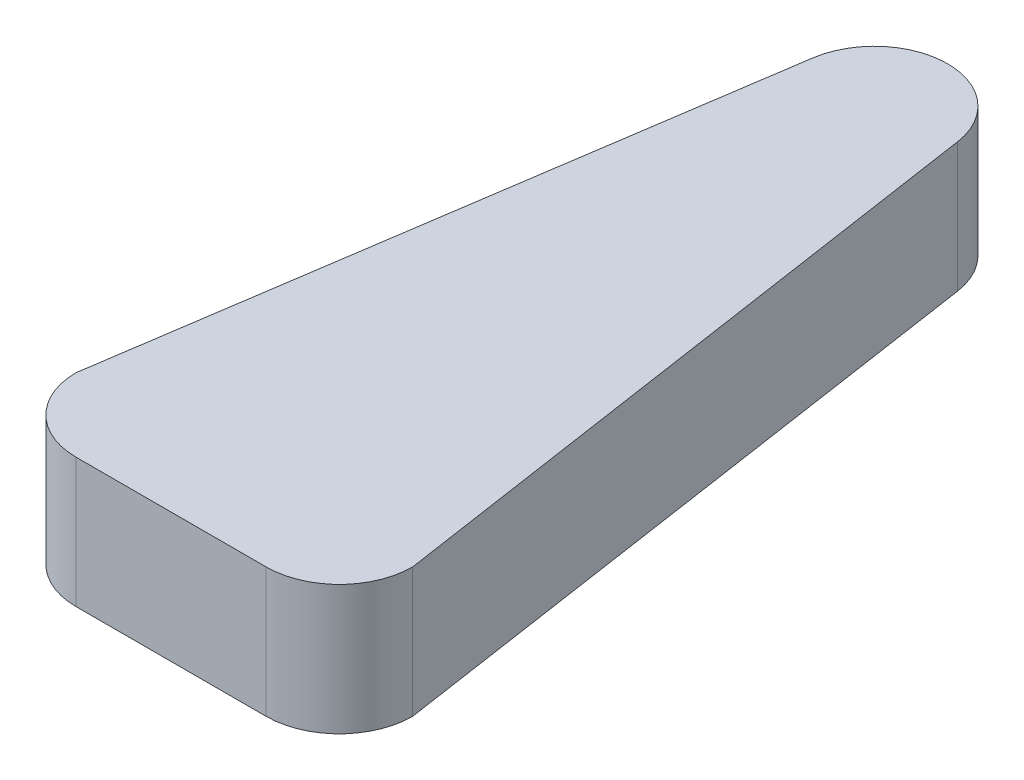
ISO-10303-21;
HEADER;
FILE_DESCRIPTION(('STEP AP214'),'2;1');
FILE_NAME('part.step','',(''),(''),'','','');
FILE_SCHEMA(('AUTOMOTIVE_DESIGN { 1 0 10303 214 1 1 1 1 }'));
ENDSEC;
DATA;
#1=APPLICATION_CONTEXT('core data for automotive mechanical design processes');
#2=APPLICATION_PROTOCOL_DEFINITION('international standard','automotive_design',2000,#1);
#3=PRODUCT_CONTEXT('',#1,'mechanical');
#4=PRODUCT('Part','Part','',(#3));
#5=PRODUCT_RELATED_PRODUCT_CATEGORY('part','',(#4));
#6=PRODUCT_DEFINITION_FORMATION('','',#4);
#7=PRODUCT_DEFINITION_CONTEXT('part definition',#1,'design');
#8=PRODUCT_DEFINITION('design','',#6,#7);
#9=PRODUCT_DEFINITION_SHAPE('','',#8);
#10=(LENGTH_UNIT() NAMED_UNIT(*) SI_UNIT(.MILLI.,.METRE.));
#11=(NAMED_UNIT(*) PLANE_ANGLE_UNIT() SI_UNIT($,.RADIAN.));
#12=(NAMED_UNIT(*) SI_UNIT($,.STERADIAN.) SOLID_ANGLE_UNIT());
#13=UNCERTAINTY_MEASURE_WITH_UNIT(LENGTH_MEASURE(1.E-05),#10,'distance_accuracy_value','');
#14=(GEOMETRIC_REPRESENTATION_CONTEXT(3) GLOBAL_UNCERTAINTY_ASSIGNED_CONTEXT((#13)) GLOBAL_UNIT_ASSIGNED_CONTEXT((#10,
#11,#12)) REPRESENTATION_CONTEXT('',''));
#15=CARTESIAN_POINT('',(0.,0.,0.));
#16=DIRECTION('',(0.,0.,1.));
#17=DIRECTION('',(1.,0.,0.));
#18=AXIS2_PLACEMENT_3D('',#15,#16,#17);
#19=CARTESIAN_POINT('',(0.,6.35,-34.5045034434509));
#20=DIRECTION('',(0.,-1.,0.));
#21=DIRECTION('',(0.,0.,-1.));
#22=AXIS2_PLACEMENT_3D('',#19,#20,#21);
#23=CYLINDRICAL_SURFACE('',#22,3.59549655654913);
#24=CARTESIAN_POINT('',(0.,0.,-34.5045034434509));
#25=DIRECTION('',(0.,1.,0.));
#26=DIRECTION('',(0.,0.,-1.));
#27=AXIS2_PLACEMENT_3D('',#24,#25,#26);
#28=CIRCLE('',#27,3.59549655654913);
#29=CARTESIAN_POINT('',(3.556,0.,-35.0359726223848));
#30=VERTEX_POINT('',#29);
#31=CARTESIAN_POINT('',(-3.556,0.,-35.0359726223848));
#32=VERTEX_POINT('',#31);
#33=EDGE_CURVE('E130',#30,#32,#28,.T.);
#34=ORIENTED_EDGE('',*,*,#33,.T.);
#35=DIRECTION('',(0.,-1.,0.));
#36=VECTOR('',#35,1.);
#37=CARTESIAN_POINT('',(-3.556,6.35,-35.0359726223848));
#38=LINE('',#37,#36);
#39=CARTESIAN_POINT('',(-3.556,6.35,-35.0359726223848));
#40=VERTEX_POINT('',#39);
#41=EDGE_CURVE('E11',#40,#32,#38,.T.);
#42=ORIENTED_EDGE('',*,*,#41,.F.);
#43=CARTESIAN_POINT('',(0.,6.35,-34.5045034434509));
#44=DIRECTION('',(0.,1.,0.));
#45=DIRECTION('',(0.,0.,-1.));
#46=AXIS2_PLACEMENT_3D('',#43,#44,#45);
#47=CIRCLE('',#46,3.59549655654913);
#48=CARTESIAN_POINT('',(3.556,6.35,-35.0359726223848));
#49=VERTEX_POINT('',#48);
#50=EDGE_CURVE('E142',#49,#40,#47,.T.);
#51=ORIENTED_EDGE('',*,*,#50,.F.);
#52=DIRECTION('',(0.,-1.,0.));
#53=VECTOR('',#52,1.);
#54=CARTESIAN_POINT('',(3.556,6.35,-35.0359726223848));
#55=LINE('',#54,#53);
#56=EDGE_CURVE('E126',#49,#30,#55,.T.);
#57=ORIENTED_EDGE('',*,*,#56,.T.);
#58=EDGE_LOOP('',(#34,#42,#51,#57));
#59=FACE_BOUND('',#58,.T.);
#60=ADVANCED_FACE('F34',(#59),#23,.T.);
#61=CARTESIAN_POINT('',(-3.556,6.35,-35.0359726223848));
#62=DIRECTION('',(0.98901499252525,0.,0.147815237916393));
#63=DIRECTION('',(0.147815237916393,0.,-0.98901499252525));
#64=AXIS2_PLACEMENT_3D('',#61,#62,#63);
#65=PLANE('',#64);
#66=DIRECTION('',(-0.147815237916393,0.,0.98901499252525));
#67=VECTOR('',#66,1.);
#68=CARTESIAN_POINT('',(-3.556,0.,-35.0359726223848));
#69=LINE('',#68,#67);
#70=CARTESIAN_POINT('',(-8.255,0.,-3.59549655654913));
#71=VERTEX_POINT('',#70);
#72=EDGE_CURVE('E133',#32,#71,#69,.T.);
#73=ORIENTED_EDGE('',*,*,#72,.T.);
#74=DIRECTION('',(0.,-1.,0.));
#75=VECTOR('',#74,1.);
#76=CARTESIAN_POINT('',(-8.255,6.35,-3.59549655654913));
#77=LINE('',#76,#75);
#78=CARTESIAN_POINT('',(-8.255,6.35,-3.59549655654913));
#79=VERTEX_POINT('',#78);
#80=EDGE_CURVE('E41',#79,#71,#77,.T.);
#81=ORIENTED_EDGE('',*,*,#80,.F.);
#82=DIRECTION('',(-0.147815237916393,0.,0.98901499252525));
#83=VECTOR('',#82,1.);
#84=CARTESIAN_POINT('',(-3.556,6.35,-35.0359726223848));
#85=LINE('',#84,#83);
#86=EDGE_CURVE('E92',#40,#79,#85,.T.);
#87=ORIENTED_EDGE('',*,*,#86,.F.);
#88=ORIENTED_EDGE('',*,*,#41,.T.);
#89=EDGE_LOOP('',(#73,#81,#87,#88));
#90=FACE_BOUND('',#89,.T.);
#91=ADVANCED_FACE('F264',(#90),#65,.F.);
#92=CARTESIAN_POINT('',(-4.65950344345087,6.35,-3.59549655654913));
#93=DIRECTION('',(0.,-1.,0.));
#94=DIRECTION('',(0.,0.,-1.));
#95=AXIS2_PLACEMENT_3D('',#92,#93,#94);
#96=CYLINDRICAL_SURFACE('',#95,3.59549655654913);
#97=CARTESIAN_POINT('',(-4.65950344345087,0.,-3.59549655654913));
#98=DIRECTION('',(0.,1.,0.));
#99=DIRECTION('',(0.,0.,-1.));
#100=AXIS2_PLACEMENT_3D('',#97,#98,#99);
#101=CIRCLE('',#100,3.59549655654913);
#102=CARTESIAN_POINT('',(-4.65950344345087,0.,0.));
#103=VERTEX_POINT('',#102);
#104=EDGE_CURVE('E136',#71,#103,#101,.T.);
#105=ORIENTED_EDGE('',*,*,#104,.T.);
#106=DIRECTION('',(0.,-1.,0.));
#107=VECTOR('',#106,1.);
#108=CARTESIAN_POINT('',(-4.65950344345087,6.35,0.));
#109=LINE('',#108,#107);
#110=CARTESIAN_POINT('',(-4.65950344345087,6.35,0.));
#111=VERTEX_POINT('',#110);
#112=EDGE_CURVE('E121',#111,#103,#109,.T.);
#113=ORIENTED_EDGE('',*,*,#112,.F.);
#114=CARTESIAN_POINT('',(-4.65950344345087,6.35,-3.59549655654913));
#115=DIRECTION('',(0.,1.,0.));
#116=DIRECTION('',(0.,0.,-1.));
#117=AXIS2_PLACEMENT_3D('',#114,#115,#116);
#118=CIRCLE('',#117,3.59549655654913);
#119=EDGE_CURVE('E109',#79,#111,#118,.T.);
#120=ORIENTED_EDGE('',*,*,#119,.F.);
#121=ORIENTED_EDGE('',*,*,#80,.T.);
#122=EDGE_LOOP('',(#105,#113,#120,#121));
#123=FACE_BOUND('',#122,.T.);
#124=ADVANCED_FACE('F148',(#123),#96,.T.);
#125=CARTESIAN_POINT('',(4.65950344345087,6.35,0.));
#126=DIRECTION('',(0.,0.,-1.));
#127=DIRECTION('',(-1.,0.,0.));
#128=AXIS2_PLACEMENT_3D('',#125,#126,#127);
#129=PLANE('',#128);
#130=DIRECTION('',(1.,0.,0.));
#131=VECTOR('',#130,1.);
#132=CARTESIAN_POINT('',(4.65950344345087,0.,0.));
#133=LINE('',#132,#131);
#134=CARTESIAN_POINT('',(4.65950344345087,0.,0.));
#135=VERTEX_POINT('',#134);
#136=EDGE_CURVE('E118',#103,#135,#133,.T.);
#137=ORIENTED_EDGE('',*,*,#136,.T.);
#138=DIRECTION('',(0.,-1.,0.));
#139=VECTOR('',#138,1.);
#140=CARTESIAN_POINT('',(4.65950344345087,6.35,0.));
#141=LINE('',#140,#139);
#142=CARTESIAN_POINT('',(4.65950344345087,6.35,0.));
#143=VERTEX_POINT('',#142);
#144=EDGE_CURVE('E115',#143,#135,#141,.T.);
#145=ORIENTED_EDGE('',*,*,#144,.F.);
#146=DIRECTION('',(1.,0.,0.));
#147=VECTOR('',#146,1.);
#148=CARTESIAN_POINT('',(4.65950344345087,6.35,0.));
#149=LINE('',#148,#147);
#150=EDGE_CURVE('E102',#111,#143,#149,.T.);
#151=ORIENTED_EDGE('',*,*,#150,.F.);
#152=ORIENTED_EDGE('',*,*,#112,.T.);
#153=EDGE_LOOP('',(#137,#145,#151,#152));
#154=FACE_BOUND('',#153,.T.);
#155=ADVANCED_FACE('F116',(#154),#129,.F.);
#156=CARTESIAN_POINT('',(4.65950344345087,6.35,-3.59549655654913));
#157=DIRECTION('',(0.,-1.,0.));
#158=DIRECTION('',(0.,0.,-1.));
#159=AXIS2_PLACEMENT_3D('',#156,#157,#158);
#160=CYLINDRICAL_SURFACE('',#159,3.59549655654913);
#161=CARTESIAN_POINT('',(4.65950344345087,0.,-3.59549655654913));
#162=DIRECTION('',(0.,1.,0.));
#163=DIRECTION('',(0.,0.,-1.));
#164=AXIS2_PLACEMENT_3D('',#161,#162,#163);
#165=CIRCLE('',#164,3.59549655654913);
#166=CARTESIAN_POINT('',(8.255,0.,-3.59549655654913));
#167=VERTEX_POINT('',#166);
#168=EDGE_CURVE('E139',#135,#167,#165,.T.);
#169=ORIENTED_EDGE('',*,*,#168,.T.);
#170=DIRECTION('',(0.,-1.,0.));
#171=VECTOR('',#170,1.);
#172=CARTESIAN_POINT('',(8.255,6.35,-3.59549655654913));
#173=LINE('',#172,#171);
#174=CARTESIAN_POINT('',(8.255,6.35,-3.59549655654913));
#175=VERTEX_POINT('',#174);
#176=EDGE_CURVE('E122',#175,#167,#173,.T.);
#177=ORIENTED_EDGE('',*,*,#176,.F.);
#178=CARTESIAN_POINT('',(4.65950344345087,6.35,-3.59549655654913));
#179=DIRECTION('',(0.,1.,0.));
#180=DIRECTION('',(0.,0.,-1.));
#181=AXIS2_PLACEMENT_3D('',#178,#179,#180);
#182=CIRCLE('',#181,3.59549655654913);
#183=EDGE_CURVE('E106',#143,#175,#182,.T.);
#184=ORIENTED_EDGE('',*,*,#183,.F.);
#185=ORIENTED_EDGE('',*,*,#144,.T.);
#186=EDGE_LOOP('',(#169,#177,#184,#185));
#187=FACE_BOUND('',#186,.T.);
#188=ADVANCED_FACE('F124',(#187),#160,.T.);
#189=CARTESIAN_POINT('',(3.556,6.35,-35.0359726223848));
#190=DIRECTION('',(-0.98901499252525,0.,0.147815237916393));
#191=DIRECTION('',(0.147815237916393,0.,0.98901499252525));
#192=AXIS2_PLACEMENT_3D('',#189,#190,#191);
#193=PLANE('',#192);
#194=DIRECTION('',(-0.147815237916393,0.,-0.98901499252525));
#195=VECTOR('',#194,1.);
#196=CARTESIAN_POINT('',(3.556,0.,-35.0359726223848));
#197=LINE('',#196,#195);
#198=EDGE_CURVE('E84',#167,#30,#197,.T.);
#199=ORIENTED_EDGE('',*,*,#198,.T.);
#200=ORIENTED_EDGE('',*,*,#56,.F.);
#201=DIRECTION('',(-0.147815237916393,0.,-0.98901499252525));
#202=VECTOR('',#201,1.);
#203=CARTESIAN_POINT('',(3.556,6.35,-35.0359726223848));
#204=LINE('',#203,#202);
#205=EDGE_CURVE('E57',#175,#49,#204,.T.);
#206=ORIENTED_EDGE('',*,*,#205,.F.);
#207=ORIENTED_EDGE('',*,*,#176,.T.);
#208=EDGE_LOOP('',(#199,#200,#206,#207));
#209=FACE_BOUND('',#208,.T.);
#210=ADVANCED_FACE('F152',(#209),#193,.F.);
#211=CARTESIAN_POINT('',(0.,6.35,-34.5045034434509));
#212=DIRECTION('',(0.,-1.,0.));
#213=DIRECTION('',(0.,0.,-1.));
#214=AXIS2_PLACEMENT_3D('',#211,#212,#213);
#215=PLANE('',#214);
#216=ORIENTED_EDGE('',*,*,#50,.T.);
#217=ORIENTED_EDGE('',*,*,#86,.T.);
#218=ORIENTED_EDGE('',*,*,#119,.T.);
#219=ORIENTED_EDGE('',*,*,#150,.T.);
#220=ORIENTED_EDGE('',*,*,#183,.T.);
#221=ORIENTED_EDGE('',*,*,#205,.T.);
#222=EDGE_LOOP('',(#216,#217,#218,#219,#220,#221));
#223=FACE_BOUND('',#222,.T.);
#224=ADVANCED_FACE('F104',(#223),#215,.F.);
#225=CARTESIAN_POINT('',(0.,0.,-34.5045034434509));
#226=DIRECTION('',(0.,-1.,0.));
#227=DIRECTION('',(0.,0.,-1.));
#228=AXIS2_PLACEMENT_3D('',#225,#226,#227);
#229=PLANE('',#228);
#230=CARTESIAN_POINT('',(-4.65950344345087,0.,-3.59549655654913));
#231=DIRECTION('',(0.,-1.,0.));
#232=DIRECTION('',(0.,0.,-1.));
#233=AXIS2_PLACEMENT_3D('',#230,#231,#232);
#234=CIRCLE('',#233,2.32549655654913);
#235=CARTESIAN_POINT('',(-4.65950344345087,0.,-1.27));
#236=VERTEX_POINT('',#235);
#237=CARTESIAN_POINT('',(-6.98347579552521,0.,-3.51131377139725));
#238=VERTEX_POINT('',#237);
#239=EDGE_CURVE('E48',#236,#238,#234,.T.);
#240=ORIENTED_EDGE('',*,*,#239,.F.);
#241=DIRECTION('',(-1.,0.,0.));
#242=VECTOR('',#241,1.);
#243=CARTESIAN_POINT('',(4.65950344345087,0.,-1.27));
#244=LINE('',#243,#242);
#245=CARTESIAN_POINT('',(4.65950344345087,0.,-1.27));
#246=VERTEX_POINT('',#245);
#247=EDGE_CURVE('E175',#246,#236,#244,.T.);
#248=ORIENTED_EDGE('',*,*,#247,.F.);
#249=CARTESIAN_POINT('',(4.65950344345087,0.,-3.59549655654913));
#250=DIRECTION('',(0.,-1.,0.));
#251=DIRECTION('',(0.,0.,-1.));
#252=AXIS2_PLACEMENT_3D('',#249,#250,#251);
#253=CIRCLE('',#252,2.32549655654913);
#254=CARTESIAN_POINT('',(6.98347579552521,0.,-3.51131377139724));
#255=VERTEX_POINT('',#254);
#256=EDGE_CURVE('E179',#255,#246,#253,.T.);
#257=ORIENTED_EDGE('',*,*,#256,.F.);
#258=DIRECTION('',(0.147815237916393,0.,0.98901499252525));
#259=VECTOR('',#258,1.);
#260=CARTESIAN_POINT('',(2.29995095949293,0.,-34.8482472702309));
#261=LINE('',#260,#259);
#262=CARTESIAN_POINT('',(2.29995095949293,0.,-34.8482472702309));
#263=VERTEX_POINT('',#262);
#264=EDGE_CURVE('E182',#263,#255,#261,.T.);
#265=ORIENTED_EDGE('',*,*,#264,.F.);
#266=CARTESIAN_POINT('',(0.,0.,-34.5045034434509));
#267=DIRECTION('',(0.,-1.,0.));
#268=DIRECTION('',(0.,0.,-1.));
#269=AXIS2_PLACEMENT_3D('',#266,#267,#268);
#270=CIRCLE('',#269,2.32549655654913);
#271=CARTESIAN_POINT('',(-2.29995095949293,0.,-34.8482472702309));
#272=VERTEX_POINT('',#271);
#273=EDGE_CURVE('E185',#272,#263,#270,.T.);
#274=ORIENTED_EDGE('',*,*,#273,.F.);
#275=DIRECTION('',(0.147815237916393,0.,-0.98901499252525));
#276=VECTOR('',#275,1.);
#277=CARTESIAN_POINT('',(-6.98347579552521,0.,-3.51131377139725));
#278=LINE('',#277,#276);
#279=EDGE_CURVE('E188',#238,#272,#278,.T.);
#280=ORIENTED_EDGE('',*,*,#279,.F.);
#281=EDGE_LOOP('',(#240,#248,#257,#265,#274,#280));
#282=FACE_BOUND('',#281,.T.);
#283=ORIENTED_EDGE('',*,*,#33,.F.);
#284=ORIENTED_EDGE('',*,*,#198,.F.);
#285=ORIENTED_EDGE('',*,*,#168,.F.);
#286=ORIENTED_EDGE('',*,*,#136,.F.);
#287=ORIENTED_EDGE('',*,*,#104,.F.);
#288=ORIENTED_EDGE('',*,*,#72,.F.);
#289=EDGE_LOOP('',(#283,#284,#285,#286,#287,#288));
#290=FACE_BOUND('',#289,.T.);
#291=ADVANCED_FACE('F151',(#282,#290),#229,.T.);
#292=CARTESIAN_POINT('',(-4.65950344345087,2.413,-3.59549655654913));
#293=DIRECTION('',(0.,-1.,0.));
#294=DIRECTION('',(0.,0.,-1.));
#295=AXIS2_PLACEMENT_3D('',#292,#293,#294);
#296=CYLINDRICAL_SURFACE('',#295,2.32549655654913);
#297=ORIENTED_EDGE('',*,*,#239,.T.);
#298=DIRECTION('',(0.,-1.,0.));
#299=VECTOR('',#298,1.);
#300=CARTESIAN_POINT('',(-6.98347579552521,2.413,-3.51131377139725));
#301=LINE('',#300,#299);
#302=CARTESIAN_POINT('',(-6.98347579552521,2.413,-3.51131377139725));
#303=VERTEX_POINT('',#302);
#304=EDGE_CURVE('E159',#303,#238,#301,.T.);
#305=ORIENTED_EDGE('',*,*,#304,.F.);
#306=CARTESIAN_POINT('',(-4.65950344345087,2.413,-3.59549655654913));
#307=DIRECTION('',(0.,-1.,0.));
#308=DIRECTION('',(0.,0.,-1.));
#309=AXIS2_PLACEMENT_3D('',#306,#307,#308);
#310=CIRCLE('',#309,2.32549655654913);
#311=CARTESIAN_POINT('',(-4.65950344345087,2.413,-1.27));
#312=VERTEX_POINT('',#311);
#313=EDGE_CURVE('E178',#312,#303,#310,.T.);
#314=ORIENTED_EDGE('',*,*,#313,.F.);
#315=DIRECTION('',(0.,-1.,0.));
#316=VECTOR('',#315,1.);
#317=CARTESIAN_POINT('',(-4.65950344345087,2.413,-1.27));
#318=LINE('',#317,#316);
#319=EDGE_CURVE('E134',#312,#236,#318,.T.);
#320=ORIENTED_EDGE('',*,*,#319,.T.);
#321=EDGE_LOOP('',(#297,#305,#314,#320));
#322=FACE_BOUND('',#321,.T.);
#323=ADVANCED_FACE('F215',(#322),#296,.F.);
#324=CARTESIAN_POINT('',(4.65950344345087,2.413,-1.27));
#325=DIRECTION('',(0.,0.,1.));
#326=DIRECTION('',(1.,0.,0.));
#327=AXIS2_PLACEMENT_3D('',#324,#325,#326);
#328=PLANE('',#327);
#329=ORIENTED_EDGE('',*,*,#247,.T.);
#330=ORIENTED_EDGE('',*,*,#319,.F.);
#331=DIRECTION('',(-1.,0.,0.));
#332=VECTOR('',#331,1.);
#333=CARTESIAN_POINT('',(4.65950344345087,2.413,-1.27));
#334=LINE('',#333,#332);
#335=CARTESIAN_POINT('',(4.65950344345087,2.413,-1.27));
#336=VERTEX_POINT('',#335);
#337=EDGE_CURVE('E162',#336,#312,#334,.T.);
#338=ORIENTED_EDGE('',*,*,#337,.F.);
#339=DIRECTION('',(0.,-1.,0.));
#340=VECTOR('',#339,1.);
#341=CARTESIAN_POINT('',(4.65950344345087,2.413,-1.27));
#342=LINE('',#341,#340);
#343=EDGE_CURVE('E171',#336,#246,#342,.T.);
#344=ORIENTED_EDGE('',*,*,#343,.T.);
#345=EDGE_LOOP('',(#329,#330,#338,#344));
#346=FACE_BOUND('',#345,.T.);
#347=ADVANCED_FACE('F231',(#346),#328,.F.);
#348=CARTESIAN_POINT('',(4.65950344345087,2.413,-3.59549655654913));
#349=DIRECTION('',(0.,-1.,0.));
#350=DIRECTION('',(0.,0.,-1.));
#351=AXIS2_PLACEMENT_3D('',#348,#349,#350);
#352=CYLINDRICAL_SURFACE('',#351,2.32549655654913);
#353=ORIENTED_EDGE('',*,*,#256,.T.);
#354=ORIENTED_EDGE('',*,*,#343,.F.);
#355=CARTESIAN_POINT('',(4.65950344345087,2.413,-3.59549655654913));
#356=DIRECTION('',(0.,-1.,0.));
#357=DIRECTION('',(0.,0.,-1.));
#358=AXIS2_PLACEMENT_3D('',#355,#356,#357);
#359=CIRCLE('',#358,2.32549655654913);
#360=CARTESIAN_POINT('',(6.98347579552521,2.413,-3.51131377139724));
#361=VERTEX_POINT('',#360);
#362=EDGE_CURVE('E194',#361,#336,#359,.T.);
#363=ORIENTED_EDGE('',*,*,#362,.F.);
#364=DIRECTION('',(0.,-1.,0.));
#365=VECTOR('',#364,1.);
#366=CARTESIAN_POINT('',(6.98347579552521,2.413,-3.51131377139724));
#367=LINE('',#366,#365);
#368=EDGE_CURVE('E168',#361,#255,#367,.T.);
#369=ORIENTED_EDGE('',*,*,#368,.T.);
#370=EDGE_LOOP('',(#353,#354,#363,#369));
#371=FACE_BOUND('',#370,.T.);
#372=ADVANCED_FACE('F236',(#371),#352,.F.);
#373=CARTESIAN_POINT('',(2.29995095949293,2.413,-34.8482472702309));
#374=DIRECTION('',(0.98901499252525,0.,-0.147815237916393));
#375=DIRECTION('',(-0.147815237916393,0.,-0.98901499252525));
#376=AXIS2_PLACEMENT_3D('',#373,#374,#375);
#377=PLANE('',#376);
#378=ORIENTED_EDGE('',*,*,#264,.T.);
#379=ORIENTED_EDGE('',*,*,#368,.F.);
#380=DIRECTION('',(0.147815237916393,0.,0.98901499252525));
#381=VECTOR('',#380,1.);
#382=CARTESIAN_POINT('',(2.29995095949293,2.413,-34.8482472702309));
#383=LINE('',#382,#381);
#384=CARTESIAN_POINT('',(2.29995095949293,2.413,-34.8482472702309));
#385=VERTEX_POINT('',#384);
#386=EDGE_CURVE('E197',#385,#361,#383,.T.);
#387=ORIENTED_EDGE('',*,*,#386,.F.);
#388=DIRECTION('',(0.,-1.,0.));
#389=VECTOR('',#388,1.);
#390=CARTESIAN_POINT('',(2.29995095949293,2.413,-34.8482472702309));
#391=LINE('',#390,#389);
#392=EDGE_CURVE('E165',#385,#263,#391,.T.);
#393=ORIENTED_EDGE('',*,*,#392,.T.);
#394=EDGE_LOOP('',(#378,#379,#387,#393));
#395=FACE_BOUND('',#394,.T.);
#396=ADVANCED_FACE('F254',(#395),#377,.F.);
#397=CARTESIAN_POINT('',(0.,2.413,-34.5045034434509));
#398=DIRECTION('',(0.,-1.,0.));
#399=DIRECTION('',(0.,0.,-1.));
#400=AXIS2_PLACEMENT_3D('',#397,#398,#399);
#401=CYLINDRICAL_SURFACE('',#400,2.32549655654913);
#402=ORIENTED_EDGE('',*,*,#273,.T.);
#403=ORIENTED_EDGE('',*,*,#392,.F.);
#404=CARTESIAN_POINT('',(0.,2.413,-34.5045034434509));
#405=DIRECTION('',(0.,-1.,0.));
#406=DIRECTION('',(0.,0.,-1.));
#407=AXIS2_PLACEMENT_3D('',#404,#405,#406);
#408=CIRCLE('',#407,2.32549655654913);
#409=CARTESIAN_POINT('',(-2.29995095949293,2.413,-34.8482472702309));
#410=VERTEX_POINT('',#409);
#411=EDGE_CURVE('E200',#410,#385,#408,.T.);
#412=ORIENTED_EDGE('',*,*,#411,.F.);
#413=DIRECTION('',(0.,-1.,0.));
#414=VECTOR('',#413,1.);
#415=CARTESIAN_POINT('',(-2.29995095949293,2.413,-34.8482472702309));
#416=LINE('',#415,#414);
#417=EDGE_CURVE('E161',#410,#272,#416,.T.);
#418=ORIENTED_EDGE('',*,*,#417,.T.);
#419=EDGE_LOOP('',(#402,#403,#412,#418));
#420=FACE_BOUND('',#419,.T.);
#421=ADVANCED_FACE('F250',(#420),#401,.F.);
#422=CARTESIAN_POINT('',(-6.98347579552521,2.413,-3.51131377139725));
#423=DIRECTION('',(-0.98901499252525,0.,-0.147815237916393));
#424=DIRECTION('',(-0.147815237916393,0.,0.98901499252525));
#425=AXIS2_PLACEMENT_3D('',#422,#423,#424);
#426=PLANE('',#425);
#427=ORIENTED_EDGE('',*,*,#279,.T.);
#428=ORIENTED_EDGE('',*,*,#417,.F.);
#429=DIRECTION('',(0.147815237916393,0.,-0.98901499252525));
#430=VECTOR('',#429,1.);
#431=CARTESIAN_POINT('',(-6.98347579552521,2.413,-3.51131377139725));
#432=LINE('',#431,#430);
#433=EDGE_CURVE('E203',#303,#410,#432,.T.);
#434=ORIENTED_EDGE('',*,*,#433,.F.);
#435=ORIENTED_EDGE('',*,*,#304,.T.);
#436=EDGE_LOOP('',(#427,#428,#434,#435));
#437=FACE_BOUND('',#436,.T.);
#438=ADVANCED_FACE('F244',(#437),#426,.F.);
#439=CARTESIAN_POINT('',(-4.65950344345087,2.413,-3.59549655654913));
#440=DIRECTION('',(0.,-1.,0.));
#441=DIRECTION('',(0.,0.,-1.));
#442=AXIS2_PLACEMENT_3D('',#439,#440,#441);
#443=PLANE('',#442);
#444=ORIENTED_EDGE('',*,*,#313,.T.);
#445=ORIENTED_EDGE('',*,*,#433,.T.);
#446=ORIENTED_EDGE('',*,*,#411,.T.);
#447=ORIENTED_EDGE('',*,*,#386,.T.);
#448=ORIENTED_EDGE('',*,*,#362,.T.);
#449=ORIENTED_EDGE('',*,*,#337,.T.);
#450=EDGE_LOOP('',(#444,#445,#446,#447,#448,#449));
#451=FACE_BOUND('',#450,.T.);
#452=ADVANCED_FACE('F210',(#451),#443,.T.);
#453=CLOSED_SHELL('',(#60,#91,#124,#155,#188,#210,#224,#291,#323,#347,#372,#396,#421,#438,#452));
#454=MANIFOLD_SOLID_BREP('B2',#453);
#455=ADVANCED_BREP_SHAPE_REPRESENTATION('',(#18,#454),#14);
#456=SHAPE_DEFINITION_REPRESENTATION(#9,#455);
ENDSEC;
END-ISO-10303-21;
